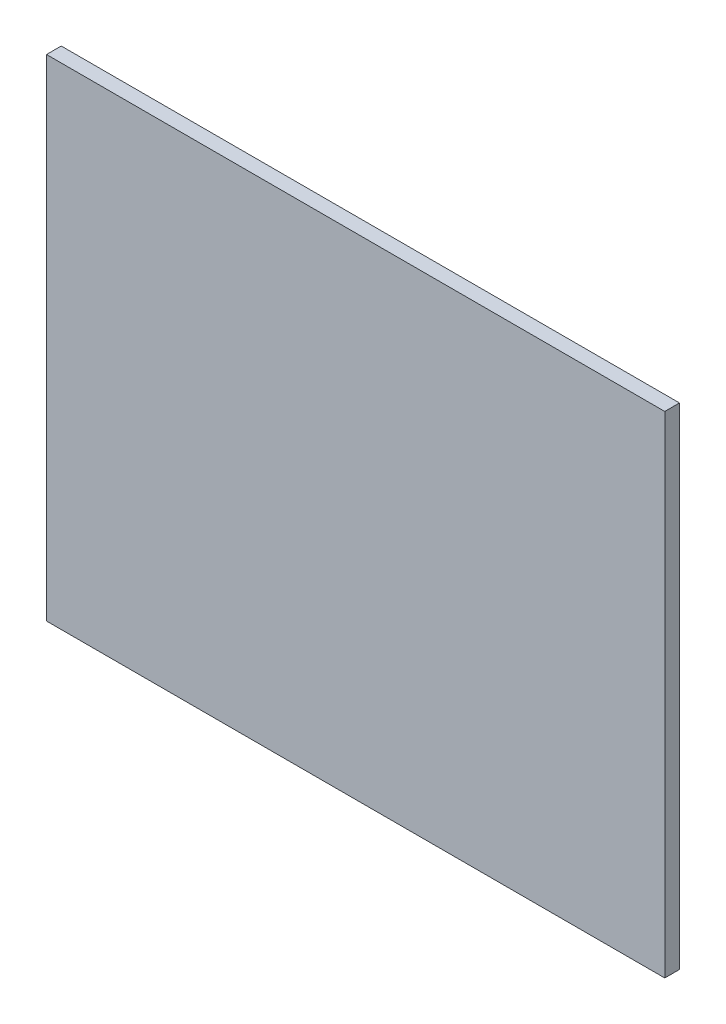
ISO-10303-21;
HEADER;
FILE_DESCRIPTION(('STEP AP214'),'2;1');
FILE_NAME('part.step','',(''),(''),'','','');
FILE_SCHEMA(('AUTOMOTIVE_DESIGN { 1 0 10303 214 1 1 1 1 }'));
ENDSEC;
DATA;
#1=APPLICATION_CONTEXT('core data for automotive mechanical design processes');
#2=APPLICATION_PROTOCOL_DEFINITION('international standard','automotive_design',2000,#1);
#3=PRODUCT_CONTEXT('',#1,'mechanical');
#4=PRODUCT('Part','Part','',(#3));
#5=PRODUCT_RELATED_PRODUCT_CATEGORY('part','',(#4));
#6=PRODUCT_DEFINITION_FORMATION('','',#4);
#7=PRODUCT_DEFINITION_CONTEXT('part definition',#1,'design');
#8=PRODUCT_DEFINITION('design','',#6,#7);
#9=PRODUCT_DEFINITION_SHAPE('','',#8);
#10=(LENGTH_UNIT() NAMED_UNIT(*) SI_UNIT(.MILLI.,.METRE.));
#11=(NAMED_UNIT(*) PLANE_ANGLE_UNIT() SI_UNIT($,.RADIAN.));
#12=(NAMED_UNIT(*) SI_UNIT($,.STERADIAN.) SOLID_ANGLE_UNIT());
#13=UNCERTAINTY_MEASURE_WITH_UNIT(LENGTH_MEASURE(1.E-05),#10,'distance_accuracy_value','');
#14=(GEOMETRIC_REPRESENTATION_CONTEXT(3) GLOBAL_UNCERTAINTY_ASSIGNED_CONTEXT((#13)) GLOBAL_UNIT_ASSIGNED_CONTEXT((#10,
#11,#12)) REPRESENTATION_CONTEXT('',''));
#15=CARTESIAN_POINT('',(0.,0.,0.));
#16=DIRECTION('',(0.,0.,1.));
#17=DIRECTION('',(1.,0.,0.));
#18=AXIS2_PLACEMENT_3D('',#15,#16,#17);
#19=CARTESIAN_POINT('',(-25.6638954869359,-23.8871733966746,1.5));
#20=DIRECTION('',(1.,0.,0.));
#21=DIRECTION('',(0.,0.,-1.));
#22=AXIS2_PLACEMENT_3D('',#19,#20,#21);
#23=PLANE('',#22);
#24=DIRECTION('',(0.,-1.,0.));
#25=VECTOR('',#24,1.);
#26=CARTESIAN_POINT('',(-25.6638954869359,-23.8871733966746,0.));
#27=LINE('',#26,#25);
#28=CARTESIAN_POINT('',(-25.6638954869359,26.1128266033254,0.));
#29=VERTEX_POINT('',#28);
#30=CARTESIAN_POINT('',(-25.6638954869359,-23.8871733966746,0.));
#31=VERTEX_POINT('',#30);
#32=EDGE_CURVE('E96',#29,#31,#27,.T.);
#33=ORIENTED_EDGE('',*,*,#32,.T.);
#34=DIRECTION('',(0.,0.,-1.));
#35=VECTOR('',#34,1.);
#36=CARTESIAN_POINT('',(-25.6638954869359,-23.8871733966746,1.5));
#37=LINE('',#36,#35);
#38=CARTESIAN_POINT('',(-25.6638954869359,-23.8871733966746,1.5));
#39=VERTEX_POINT('',#38);
#40=EDGE_CURVE('E11',#39,#31,#37,.T.);
#41=ORIENTED_EDGE('',*,*,#40,.F.);
#42=DIRECTION('',(0.,-1.,0.));
#43=VECTOR('',#42,1.);
#44=CARTESIAN_POINT('',(-25.6638954869359,-23.8871733966746,1.5));
#45=LINE('',#44,#43);
#46=CARTESIAN_POINT('',(-25.6638954869359,26.1128266033254,1.5));
#47=VERTEX_POINT('',#46);
#48=EDGE_CURVE('E84',#47,#39,#45,.T.);
#49=ORIENTED_EDGE('',*,*,#48,.F.);
#50=DIRECTION('',(0.,0.,-1.));
#51=VECTOR('',#50,1.);
#52=CARTESIAN_POINT('',(-25.6638954869359,26.1128266033254,1.5));
#53=LINE('',#52,#51);
#54=EDGE_CURVE('E92',#47,#29,#53,.T.);
#55=ORIENTED_EDGE('',*,*,#54,.T.);
#56=EDGE_LOOP('',(#33,#41,#49,#55));
#57=FACE_BOUND('',#56,.T.);
#58=ADVANCED_FACE('F33',(#57),#23,.F.);
#59=CARTESIAN_POINT('',(-25.6638954869359,-23.8871733966746,1.5));
#60=DIRECTION('',(0.,1.,0.));
#61=DIRECTION('',(0.,0.,1.));
#62=AXIS2_PLACEMENT_3D('',#59,#60,#61);
#63=PLANE('',#62);
#64=DIRECTION('',(1.,0.,0.));
#65=VECTOR('',#64,1.);
#66=CARTESIAN_POINT('',(-25.6638954869359,-23.8871733966746,0.));
#67=LINE('',#66,#65);
#68=CARTESIAN_POINT('',(37.3361045130641,-23.8871733966746,0.));
#69=VERTEX_POINT('',#68);
#70=EDGE_CURVE('E88',#31,#69,#67,.T.);
#71=ORIENTED_EDGE('',*,*,#70,.T.);
#72=DIRECTION('',(0.,0.,-1.));
#73=VECTOR('',#72,1.);
#74=CARTESIAN_POINT('',(37.3361045130641,-23.8871733966746,1.5));
#75=LINE('',#74,#73);
#76=CARTESIAN_POINT('',(37.3361045130641,-23.8871733966746,1.5));
#77=VERTEX_POINT('',#76);
#78=EDGE_CURVE('E41',#77,#69,#75,.T.);
#79=ORIENTED_EDGE('',*,*,#78,.F.);
#80=DIRECTION('',(1.,0.,0.));
#81=VECTOR('',#80,1.);
#82=CARTESIAN_POINT('',(-25.6638954869359,-23.8871733966746,1.5));
#83=LINE('',#82,#81);
#84=EDGE_CURVE('E79',#39,#77,#83,.T.);
#85=ORIENTED_EDGE('',*,*,#84,.F.);
#86=ORIENTED_EDGE('',*,*,#40,.T.);
#87=EDGE_LOOP('',(#71,#79,#85,#86));
#88=FACE_BOUND('',#87,.T.);
#89=ADVANCED_FACE('F87',(#88),#63,.F.);
#90=CARTESIAN_POINT('',(37.3361045130641,-23.8871733966746,1.5));
#91=DIRECTION('',(-1.,0.,0.));
#92=DIRECTION('',(0.,-1.,0.));
#93=AXIS2_PLACEMENT_3D('',#90,#91,#92);
#94=PLANE('',#93);
#95=DIRECTION('',(0.,1.,0.));
#96=VECTOR('',#95,1.);
#97=CARTESIAN_POINT('',(37.3361045130641,-23.8871733966746,0.));
#98=LINE('',#97,#96);
#99=CARTESIAN_POINT('',(37.3361045130641,26.1128266033254,0.));
#100=VERTEX_POINT('',#99);
#101=EDGE_CURVE('E66',#69,#100,#98,.T.);
#102=ORIENTED_EDGE('',*,*,#101,.T.);
#103=DIRECTION('',(0.,0.,-1.));
#104=VECTOR('',#103,1.);
#105=CARTESIAN_POINT('',(37.3361045130641,26.1128266033254,1.5));
#106=LINE('',#105,#104);
#107=CARTESIAN_POINT('',(37.3361045130641,26.1128266033254,1.5));
#108=VERTEX_POINT('',#107);
#109=EDGE_CURVE('E89',#108,#100,#106,.T.);
#110=ORIENTED_EDGE('',*,*,#109,.F.);
#111=DIRECTION('',(0.,1.,0.));
#112=VECTOR('',#111,1.);
#113=CARTESIAN_POINT('',(37.3361045130641,-23.8871733966746,1.5));
#114=LINE('',#113,#112);
#115=EDGE_CURVE('E82',#77,#108,#114,.T.);
#116=ORIENTED_EDGE('',*,*,#115,.F.);
#117=ORIENTED_EDGE('',*,*,#78,.T.);
#118=EDGE_LOOP('',(#102,#110,#116,#117));
#119=FACE_BOUND('',#118,.T.);
#120=ADVANCED_FACE('F90',(#119),#94,.F.);
#121=CARTESIAN_POINT('',(-25.6638954869359,26.1128266033254,1.5));
#122=DIRECTION('',(0.,-1.,0.));
#123=DIRECTION('',(0.,0.,-1.));
#124=AXIS2_PLACEMENT_3D('',#121,#122,#123);
#125=PLANE('',#124);
#126=DIRECTION('',(-1.,0.,0.));
#127=VECTOR('',#126,1.);
#128=CARTESIAN_POINT('',(-25.6638954869359,26.1128266033254,0.));
#129=LINE('',#128,#127);
#130=EDGE_CURVE('E72',#100,#29,#129,.T.);
#131=ORIENTED_EDGE('',*,*,#130,.T.);
#132=ORIENTED_EDGE('',*,*,#54,.F.);
#133=DIRECTION('',(-1.,0.,0.));
#134=VECTOR('',#133,1.);
#135=CARTESIAN_POINT('',(-25.6638954869359,26.1128266033254,1.5));
#136=LINE('',#135,#134);
#137=EDGE_CURVE('E49',#108,#47,#136,.T.);
#138=ORIENTED_EDGE('',*,*,#137,.F.);
#139=ORIENTED_EDGE('',*,*,#109,.T.);
#140=EDGE_LOOP('',(#131,#132,#138,#139));
#141=FACE_BOUND('',#140,.T.);
#142=ADVANCED_FACE('F103',(#141),#125,.F.);
#143=CARTESIAN_POINT('',(0.,0.,1.5));
#144=DIRECTION('',(0.,0.,-1.));
#145=DIRECTION('',(-1.,0.,0.));
#146=AXIS2_PLACEMENT_3D('',#143,#144,#145);
#147=PLANE('',#146);
#148=ORIENTED_EDGE('',*,*,#48,.T.);
#149=ORIENTED_EDGE('',*,*,#84,.T.);
#150=ORIENTED_EDGE('',*,*,#115,.T.);
#151=ORIENTED_EDGE('',*,*,#137,.T.);
#152=EDGE_LOOP('',(#148,#149,#150,#151));
#153=FACE_BOUND('',#152,.T.);
#154=ADVANCED_FACE('F80',(#153),#147,.F.);
#155=CARTESIAN_POINT('',(0.,0.,0.));
#156=DIRECTION('',(0.,0.,-1.));
#157=DIRECTION('',(-1.,0.,0.));
#158=AXIS2_PLACEMENT_3D('',#155,#156,#157);
#159=PLANE('',#158);
#160=ORIENTED_EDGE('',*,*,#32,.F.);
#161=ORIENTED_EDGE('',*,*,#130,.F.);
#162=ORIENTED_EDGE('',*,*,#101,.F.);
#163=ORIENTED_EDGE('',*,*,#70,.F.);
#164=EDGE_LOOP('',(#160,#161,#162,#163));
#165=FACE_BOUND('',#164,.T.);
#166=ADVANCED_FACE('F106',(#165),#159,.T.);
#167=CLOSED_SHELL('',(#58,#89,#120,#142,#154,#166));
#168=MANIFOLD_SOLID_BREP('B2',#167);
#169=ADVANCED_BREP_SHAPE_REPRESENTATION('',(#18,#168),#14);
#170=SHAPE_DEFINITION_REPRESENTATION(#9,#169);
ENDSEC;
END-ISO-10303-21;
